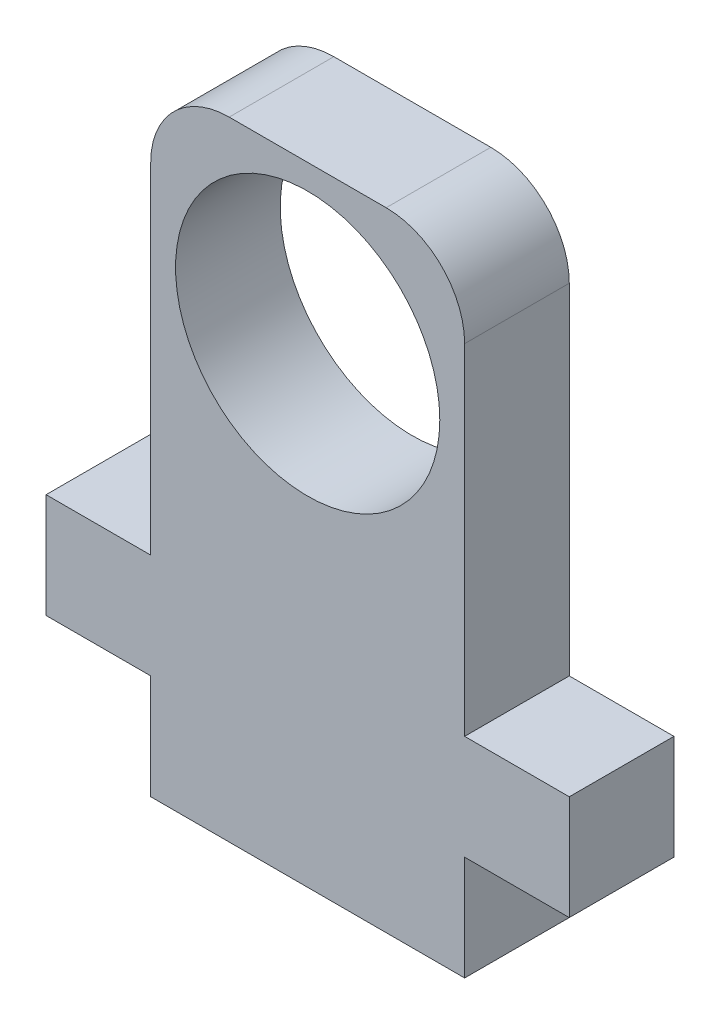
ISO-10303-21;
HEADER;
FILE_DESCRIPTION(('STEP AP214'),'2;1');
FILE_NAME('part.step','',(''),(''),'','','');
FILE_SCHEMA(('AUTOMOTIVE_DESIGN { 1 0 10303 214 1 1 1 1 }'));
ENDSEC;
DATA;
#1=APPLICATION_CONTEXT('core data for automotive mechanical design processes');
#2=APPLICATION_PROTOCOL_DEFINITION('international standard','automotive_design',2000,#1);
#3=PRODUCT_CONTEXT('',#1,'mechanical');
#4=PRODUCT('Part','Part','',(#3));
#5=PRODUCT_RELATED_PRODUCT_CATEGORY('part','',(#4));
#6=PRODUCT_DEFINITION_FORMATION('','',#4);
#7=PRODUCT_DEFINITION_CONTEXT('part definition',#1,'design');
#8=PRODUCT_DEFINITION('design','',#6,#7);
#9=PRODUCT_DEFINITION_SHAPE('','',#8);
#10=(LENGTH_UNIT() NAMED_UNIT(*) SI_UNIT(.MILLI.,.METRE.));
#11=(NAMED_UNIT(*) PLANE_ANGLE_UNIT() SI_UNIT($,.RADIAN.));
#12=(NAMED_UNIT(*) SI_UNIT($,.STERADIAN.) SOLID_ANGLE_UNIT());
#13=UNCERTAINTY_MEASURE_WITH_UNIT(LENGTH_MEASURE(1.E-05),#10,'distance_accuracy_value','');
#14=(GEOMETRIC_REPRESENTATION_CONTEXT(3) GLOBAL_UNCERTAINTY_ASSIGNED_CONTEXT((#13)) GLOBAL_UNIT_ASSIGNED_CONTEXT((#10,
#11,#12)) REPRESENTATION_CONTEXT('',''));
#15=CARTESIAN_POINT('',(0.,0.,0.));
#16=DIRECTION('',(0.,0.,1.));
#17=DIRECTION('',(1.,0.,0.));
#18=AXIS2_PLACEMENT_3D('',#15,#16,#17);
#19=CARTESIAN_POINT('',(7.,17.,4.));
#20=DIRECTION('',(0.,0.,-1.));
#21=DIRECTION('',(-1.,0.,0.));
#22=AXIS2_PLACEMENT_3D('',#19,#20,#21);
#23=PLANE('',#22);
#24=DIRECTION('',(1.,0.,0.));
#25=VECTOR('',#24,1.);
#26=CARTESIAN_POINT('',(4.,0.,4.));
#27=LINE('',#26,#25);
#28=CARTESIAN_POINT('',(0.,0.,4.));
#29=VERTEX_POINT('',#28);
#30=CARTESIAN_POINT('',(4.,0.,4.));
#31=VERTEX_POINT('',#30);
#32=EDGE_CURVE('E197',#29,#31,#27,.T.);
#33=ORIENTED_EDGE('',*,*,#32,.T.);
#34=DIRECTION('',(0.,-1.,0.));
#35=VECTOR('',#34,1.);
#36=CARTESIAN_POINT('',(4.,-4.,4.));
#37=LINE('',#36,#35);
#38=CARTESIAN_POINT('',(4.,-4.,4.));
#39=VERTEX_POINT('',#38);
#40=EDGE_CURVE('E114',#31,#39,#37,.T.);
#41=ORIENTED_EDGE('',*,*,#40,.T.);
#42=DIRECTION('',(1.,0.,0.));
#43=VECTOR('',#42,1.);
#44=CARTESIAN_POINT('',(16.,-4.,4.));
#45=LINE('',#44,#43);
#46=CARTESIAN_POINT('',(16.,-4.,4.));
#47=VERTEX_POINT('',#46);
#48=EDGE_CURVE('E230',#39,#47,#45,.T.);
#49=ORIENTED_EDGE('',*,*,#48,.T.);
#50=DIRECTION('',(0.,1.,0.));
#51=VECTOR('',#50,1.);
#52=CARTESIAN_POINT('',(16.,0.,4.));
#53=LINE('',#52,#51);
#54=CARTESIAN_POINT('',(16.,0.,4.));
#55=VERTEX_POINT('',#54);
#56=EDGE_CURVE('E249',#47,#55,#53,.T.);
#57=ORIENTED_EDGE('',*,*,#56,.T.);
#58=DIRECTION('',(1.,0.,0.));
#59=VECTOR('',#58,1.);
#60=CARTESIAN_POINT('',(20.,0.,4.));
#61=LINE('',#60,#59);
#62=CARTESIAN_POINT('',(20.,0.,4.));
#63=VERTEX_POINT('',#62);
#64=EDGE_CURVE('E246',#55,#63,#61,.T.);
#65=ORIENTED_EDGE('',*,*,#64,.T.);
#66=DIRECTION('',(0.,1.,0.));
#67=VECTOR('',#66,1.);
#68=CARTESIAN_POINT('',(20.,4.,4.));
#69=LINE('',#68,#67);
#70=CARTESIAN_POINT('',(20.,4.,4.));
#71=VERTEX_POINT('',#70);
#72=EDGE_CURVE('E248',#63,#71,#69,.T.);
#73=ORIENTED_EDGE('',*,*,#72,.T.);
#74=DIRECTION('',(-1.,0.,0.));
#75=VECTOR('',#74,1.);
#76=CARTESIAN_POINT('',(16.,4.,4.));
#77=LINE('',#76,#75);
#78=CARTESIAN_POINT('',(16.,4.,4.));
#79=VERTEX_POINT('',#78);
#80=EDGE_CURVE('E251',#71,#79,#77,.T.);
#81=ORIENTED_EDGE('',*,*,#80,.T.);
#82=DIRECTION('',(0.,1.,0.));
#83=VECTOR('',#82,1.);
#84=CARTESIAN_POINT('',(16.,8.,4.));
#85=LINE('',#84,#83);
#86=CARTESIAN_POINT('',(16.,17.,4.));
#87=VERTEX_POINT('',#86);
#88=EDGE_CURVE('E257',#79,#87,#85,.T.);
#89=ORIENTED_EDGE('',*,*,#88,.T.);
#90=CARTESIAN_POINT('',(13.,17.,4.));
#91=DIRECTION('',(0.,0.,1.));
#92=DIRECTION('',(-1.,0.,0.));
#93=AXIS2_PLACEMENT_3D('',#90,#91,#92);
#94=CIRCLE('',#93,3.);
#95=CARTESIAN_POINT('',(13.,20.,4.));
#96=VERTEX_POINT('',#95);
#97=EDGE_CURVE('E259',#87,#96,#94,.T.);
#98=ORIENTED_EDGE('',*,*,#97,.T.);
#99=DIRECTION('',(-1.,0.,0.));
#100=VECTOR('',#99,1.);
#101=CARTESIAN_POINT('',(7.00000000000002,20.,4.));
#102=LINE('',#101,#100);
#103=CARTESIAN_POINT('',(7.00000000000002,20.,4.));
#104=VERTEX_POINT('',#103);
#105=EDGE_CURVE('E261',#96,#104,#102,.T.);
#106=ORIENTED_EDGE('',*,*,#105,.T.);
#107=CARTESIAN_POINT('',(7.,17.,4.));
#108=DIRECTION('',(0.,0.,1.));
#109=DIRECTION('',(-1.,0.,0.));
#110=AXIS2_PLACEMENT_3D('',#107,#108,#109);
#111=CIRCLE('',#110,3.);
#112=CARTESIAN_POINT('',(4.,17.,4.));
#113=VERTEX_POINT('',#112);
#114=EDGE_CURVE('E151',#104,#113,#111,.T.);
#115=ORIENTED_EDGE('',*,*,#114,.T.);
#116=DIRECTION('',(0.,-1.,0.));
#117=VECTOR('',#116,1.);
#118=CARTESIAN_POINT('',(4.,8.,4.));
#119=LINE('',#118,#117);
#120=CARTESIAN_POINT('',(4.,4.,4.));
#121=VERTEX_POINT('',#120);
#122=EDGE_CURVE('E145',#113,#121,#119,.T.);
#123=ORIENTED_EDGE('',*,*,#122,.T.);
#124=DIRECTION('',(-1.,0.,0.));
#125=VECTOR('',#124,1.);
#126=CARTESIAN_POINT('',(0.,4.,4.));
#127=LINE('',#126,#125);
#128=CARTESIAN_POINT('',(0.,4.,4.));
#129=VERTEX_POINT('',#128);
#130=EDGE_CURVE('E149',#121,#129,#127,.T.);
#131=ORIENTED_EDGE('',*,*,#130,.T.);
#132=DIRECTION('',(0.,-1.,0.));
#133=VECTOR('',#132,1.);
#134=CARTESIAN_POINT('',(0.,0.,4.));
#135=LINE('',#134,#133);
#136=EDGE_CURVE('E53',#129,#29,#135,.T.);
#137=ORIENTED_EDGE('',*,*,#136,.T.);
#138=EDGE_LOOP('',(#33,#41,#49,#57,#65,#73,#81,#89,#98,#106,#115,#123,#131,#137));
#139=FACE_BOUND('',#138,.T.);
#140=CARTESIAN_POINT('',(10.,14.,4.));
#141=DIRECTION('',(0.,0.,1.));
#142=DIRECTION('',(1.,0.,0.));
#143=AXIS2_PLACEMENT_3D('',#140,#141,#142);
#144=CIRCLE('',#143,5.05);
#145=CARTESIAN_POINT('',(15.05,14.,4.));
#146=VERTEX_POINT('',#145);
#147=EDGE_CURVE('E172',#146,#146,#144,.T.);
#148=ORIENTED_EDGE('',*,*,#147,.F.);
#149=EDGE_LOOP('',(#148));
#150=FACE_BOUND('',#149,.T.);
#151=ADVANCED_FACE('F36',(#139,#150),#23,.F.);
#152=CARTESIAN_POINT('',(7.,17.,0.));
#153=DIRECTION('',(0.,0.,-1.));
#154=DIRECTION('',(-1.,0.,0.));
#155=AXIS2_PLACEMENT_3D('',#152,#153,#154);
#156=PLANE('',#155);
#157=DIRECTION('',(1.,0.,0.));
#158=VECTOR('',#157,1.);
#159=CARTESIAN_POINT('',(4.,0.,0.));
#160=LINE('',#159,#158);
#161=CARTESIAN_POINT('',(0.,0.,0.));
#162=VERTEX_POINT('',#161);
#163=CARTESIAN_POINT('',(4.,0.,0.));
#164=VERTEX_POINT('',#163);
#165=EDGE_CURVE('E168',#162,#164,#160,.T.);
#166=ORIENTED_EDGE('',*,*,#165,.F.);
#167=DIRECTION('',(0.,-1.,0.));
#168=VECTOR('',#167,1.);
#169=CARTESIAN_POINT('',(0.,0.,0.));
#170=LINE('',#169,#168);
#171=CARTESIAN_POINT('',(0.,4.,0.));
#172=VERTEX_POINT('',#171);
#173=EDGE_CURVE('E106',#172,#162,#170,.T.);
#174=ORIENTED_EDGE('',*,*,#173,.F.);
#175=DIRECTION('',(-1.,0.,0.));
#176=VECTOR('',#175,1.);
#177=CARTESIAN_POINT('',(0.,4.,0.));
#178=LINE('',#177,#176);
#179=CARTESIAN_POINT('',(4.,4.,0.));
#180=VERTEX_POINT('',#179);
#181=EDGE_CURVE('E100',#180,#172,#178,.T.);
#182=ORIENTED_EDGE('',*,*,#181,.F.);
#183=DIRECTION('',(0.,-1.,0.));
#184=VECTOR('',#183,1.);
#185=CARTESIAN_POINT('',(4.,4.,0.));
#186=LINE('',#185,#184);
#187=CARTESIAN_POINT('',(4.,17.,0.));
#188=VERTEX_POINT('',#187);
#189=EDGE_CURVE('E158',#188,#180,#186,.T.);
#190=ORIENTED_EDGE('',*,*,#189,.F.);
#191=CARTESIAN_POINT('',(7.,17.,0.));
#192=DIRECTION('',(0.,0.,1.));
#193=DIRECTION('',(-1.,0.,0.));
#194=AXIS2_PLACEMENT_3D('',#191,#192,#193);
#195=CIRCLE('',#194,3.);
#196=CARTESIAN_POINT('',(7.00000000000002,20.,0.));
#197=VERTEX_POINT('',#196);
#198=EDGE_CURVE('E191',#197,#188,#195,.T.);
#199=ORIENTED_EDGE('',*,*,#198,.F.);
#200=DIRECTION('',(-1.,0.,0.));
#201=VECTOR('',#200,1.);
#202=CARTESIAN_POINT('',(7.00000000000002,20.,0.));
#203=LINE('',#202,#201);
#204=CARTESIAN_POINT('',(13.,20.,0.));
#205=VERTEX_POINT('',#204);
#206=EDGE_CURVE('E189',#205,#197,#203,.T.);
#207=ORIENTED_EDGE('',*,*,#206,.F.);
#208=CARTESIAN_POINT('',(13.,17.,0.));
#209=DIRECTION('',(0.,0.,1.));
#210=DIRECTION('',(-1.,0.,0.));
#211=AXIS2_PLACEMENT_3D('',#208,#209,#210);
#212=CIRCLE('',#211,3.);
#213=CARTESIAN_POINT('',(16.,17.,0.));
#214=VERTEX_POINT('',#213);
#215=EDGE_CURVE('E187',#214,#205,#212,.T.);
#216=ORIENTED_EDGE('',*,*,#215,.F.);
#217=DIRECTION('',(0.,1.,0.));
#218=VECTOR('',#217,1.);
#219=CARTESIAN_POINT('',(16.,17.,0.));
#220=LINE('',#219,#218);
#221=CARTESIAN_POINT('',(16.,4.,0.));
#222=VERTEX_POINT('',#221);
#223=EDGE_CURVE('E185',#222,#214,#220,.T.);
#224=ORIENTED_EDGE('',*,*,#223,.F.);
#225=DIRECTION('',(-1.,0.,0.));
#226=VECTOR('',#225,1.);
#227=CARTESIAN_POINT('',(16.,4.,0.));
#228=LINE('',#227,#226);
#229=CARTESIAN_POINT('',(20.,4.,0.));
#230=VERTEX_POINT('',#229);
#231=EDGE_CURVE('E182',#230,#222,#228,.T.);
#232=ORIENTED_EDGE('',*,*,#231,.F.);
#233=DIRECTION('',(0.,1.,0.));
#234=VECTOR('',#233,1.);
#235=CARTESIAN_POINT('',(20.,4.,0.));
#236=LINE('',#235,#234);
#237=CARTESIAN_POINT('',(20.,0.,0.));
#238=VERTEX_POINT('',#237);
#239=EDGE_CURVE('E180',#238,#230,#236,.T.);
#240=ORIENTED_EDGE('',*,*,#239,.F.);
#241=DIRECTION('',(1.,0.,0.));
#242=VECTOR('',#241,1.);
#243=CARTESIAN_POINT('',(20.,0.,0.));
#244=LINE('',#243,#242);
#245=CARTESIAN_POINT('',(16.,0.,0.));
#246=VERTEX_POINT('',#245);
#247=EDGE_CURVE('E178',#246,#238,#244,.T.);
#248=ORIENTED_EDGE('',*,*,#247,.F.);
#249=DIRECTION('',(0.,1.,0.));
#250=VECTOR('',#249,1.);
#251=CARTESIAN_POINT('',(16.,0.,0.));
#252=LINE('',#251,#250);
#253=CARTESIAN_POINT('',(16.,-4.,0.));
#254=VERTEX_POINT('',#253);
#255=EDGE_CURVE('E176',#254,#246,#252,.T.);
#256=ORIENTED_EDGE('',*,*,#255,.F.);
#257=DIRECTION('',(1.,0.,0.));
#258=VECTOR('',#257,1.);
#259=CARTESIAN_POINT('',(16.,-4.,0.));
#260=LINE('',#259,#258);
#261=CARTESIAN_POINT('',(4.,-4.,0.));
#262=VERTEX_POINT('',#261);
#263=EDGE_CURVE('E174',#262,#254,#260,.T.);
#264=ORIENTED_EDGE('',*,*,#263,.F.);
#265=DIRECTION('',(0.,-1.,0.));
#266=VECTOR('',#265,1.);
#267=CARTESIAN_POINT('',(4.,-4.,0.));
#268=LINE('',#267,#266);
#269=EDGE_CURVE('E171',#164,#262,#268,.T.);
#270=ORIENTED_EDGE('',*,*,#269,.F.);
#271=EDGE_LOOP('',(#166,#174,#182,#190,#199,#207,#216,#224,#232,#240,#248,#256,#264,#270));
#272=FACE_BOUND('',#271,.T.);
#273=CARTESIAN_POINT('',(10.,14.,0.));
#274=DIRECTION('',(0.,0.,1.));
#275=DIRECTION('',(1.,0.,0.));
#276=AXIS2_PLACEMENT_3D('',#273,#274,#275);
#277=CIRCLE('',#276,5.05);
#278=CARTESIAN_POINT('',(15.05,14.,0.));
#279=VERTEX_POINT('',#278);
#280=EDGE_CURVE('E439',#279,#279,#277,.T.);
#281=ORIENTED_EDGE('',*,*,#280,.T.);
#282=EDGE_LOOP('',(#281));
#283=FACE_BOUND('',#282,.T.);
#284=ADVANCED_FACE('F234',(#272,#283),#156,.T.);
#285=CARTESIAN_POINT('',(4.,0.,4.));
#286=DIRECTION('',(0.,1.,0.));
#287=DIRECTION('',(-1.,0.,0.));
#288=AXIS2_PLACEMENT_3D('',#285,#286,#287);
#289=PLANE('',#288);
#290=ORIENTED_EDGE('',*,*,#165,.T.);
#291=DIRECTION('',(0.,0.,-1.));
#292=VECTOR('',#291,1.);
#293=CARTESIAN_POINT('',(4.,0.,4.));
#294=LINE('',#293,#292);
#295=EDGE_CURVE('E11',#31,#164,#294,.T.);
#296=ORIENTED_EDGE('',*,*,#295,.F.);
#297=ORIENTED_EDGE('',*,*,#32,.F.);
#298=DIRECTION('',(0.,0.,-1.));
#299=VECTOR('',#298,1.);
#300=CARTESIAN_POINT('',(0.,0.,4.));
#301=LINE('',#300,#299);
#302=EDGE_CURVE('E164',#29,#162,#301,.T.);
#303=ORIENTED_EDGE('',*,*,#302,.T.);
#304=EDGE_LOOP('',(#290,#296,#297,#303));
#305=FACE_BOUND('',#304,.T.);
#306=ADVANCED_FACE('F38',(#305),#289,.F.);
#307=CARTESIAN_POINT('',(4.,-4.,4.));
#308=DIRECTION('',(1.,0.,0.));
#309=DIRECTION('',(0.,0.,-1.));
#310=AXIS2_PLACEMENT_3D('',#307,#308,#309);
#311=PLANE('',#310);
#312=ORIENTED_EDGE('',*,*,#269,.T.);
#313=DIRECTION('',(0.,0.,-1.));
#314=VECTOR('',#313,1.);
#315=CARTESIAN_POINT('',(4.,-4.,4.));
#316=LINE('',#315,#314);
#317=EDGE_CURVE('E45',#39,#262,#316,.T.);
#318=ORIENTED_EDGE('',*,*,#317,.F.);
#319=ORIENTED_EDGE('',*,*,#40,.F.);
#320=ORIENTED_EDGE('',*,*,#295,.T.);
#321=EDGE_LOOP('',(#312,#318,#319,#320));
#322=FACE_BOUND('',#321,.T.);
#323=ADVANCED_FACE('F296',(#322),#311,.F.);
#324=CARTESIAN_POINT('',(16.,-4.,4.));
#325=DIRECTION('',(0.,1.,0.));
#326=DIRECTION('',(-1.,0.,0.));
#327=AXIS2_PLACEMENT_3D('',#324,#325,#326);
#328=PLANE('',#327);
#329=ORIENTED_EDGE('',*,*,#263,.T.);
#330=DIRECTION('',(0.,0.,-1.));
#331=VECTOR('',#330,1.);
#332=CARTESIAN_POINT('',(16.,-4.,4.));
#333=LINE('',#332,#331);
#334=EDGE_CURVE('E222',#47,#254,#333,.T.);
#335=ORIENTED_EDGE('',*,*,#334,.F.);
#336=ORIENTED_EDGE('',*,*,#48,.F.);
#337=ORIENTED_EDGE('',*,*,#317,.T.);
#338=EDGE_LOOP('',(#329,#335,#336,#337));
#339=FACE_BOUND('',#338,.T.);
#340=ADVANCED_FACE('F228',(#339),#328,.F.);
#341=CARTESIAN_POINT('',(16.,0.,4.));
#342=DIRECTION('',(-1.,0.,0.));
#343=DIRECTION('',(0.,0.,1.));
#344=AXIS2_PLACEMENT_3D('',#341,#342,#343);
#345=PLANE('',#344);
#346=ORIENTED_EDGE('',*,*,#255,.T.);
#347=DIRECTION('',(0.,0.,-1.));
#348=VECTOR('',#347,1.);
#349=CARTESIAN_POINT('',(16.,0.,4.));
#350=LINE('',#349,#348);
#351=EDGE_CURVE('E219',#55,#246,#350,.T.);
#352=ORIENTED_EDGE('',*,*,#351,.F.);
#353=ORIENTED_EDGE('',*,*,#56,.F.);
#354=ORIENTED_EDGE('',*,*,#334,.T.);
#355=EDGE_LOOP('',(#346,#352,#353,#354));
#356=FACE_BOUND('',#355,.T.);
#357=ADVANCED_FACE('F240',(#356),#345,.F.);
#358=CARTESIAN_POINT('',(20.,0.,4.));
#359=DIRECTION('',(0.,1.,0.));
#360=DIRECTION('',(-1.,0.,0.));
#361=AXIS2_PLACEMENT_3D('',#358,#359,#360);
#362=PLANE('',#361);
#363=ORIENTED_EDGE('',*,*,#247,.T.);
#364=DIRECTION('',(0.,0.,-1.));
#365=VECTOR('',#364,1.);
#366=CARTESIAN_POINT('',(20.,0.,4.));
#367=LINE('',#366,#365);
#368=EDGE_CURVE('E216',#63,#238,#367,.T.);
#369=ORIENTED_EDGE('',*,*,#368,.F.);
#370=ORIENTED_EDGE('',*,*,#64,.F.);
#371=ORIENTED_EDGE('',*,*,#351,.T.);
#372=EDGE_LOOP('',(#363,#369,#370,#371));
#373=FACE_BOUND('',#372,.T.);
#374=ADVANCED_FACE('F244',(#373),#362,.F.);
#375=CARTESIAN_POINT('',(20.,4.,4.));
#376=DIRECTION('',(-1.,0.,0.));
#377=DIRECTION('',(0.,0.,1.));
#378=AXIS2_PLACEMENT_3D('',#375,#376,#377);
#379=PLANE('',#378);
#380=ORIENTED_EDGE('',*,*,#239,.T.);
#381=DIRECTION('',(0.,0.,-1.));
#382=VECTOR('',#381,1.);
#383=CARTESIAN_POINT('',(20.,4.,4.));
#384=LINE('',#383,#382);
#385=EDGE_CURVE('E213',#71,#230,#384,.T.);
#386=ORIENTED_EDGE('',*,*,#385,.F.);
#387=ORIENTED_EDGE('',*,*,#72,.F.);
#388=ORIENTED_EDGE('',*,*,#368,.T.);
#389=EDGE_LOOP('',(#380,#386,#387,#388));
#390=FACE_BOUND('',#389,.T.);
#391=ADVANCED_FACE('F309',(#390),#379,.F.);
#392=CARTESIAN_POINT('',(16.,4.,4.));
#393=DIRECTION('',(0.,-1.,0.));
#394=DIRECTION('',(0.,0.,-1.));
#395=AXIS2_PLACEMENT_3D('',#392,#393,#394);
#396=PLANE('',#395);
#397=ORIENTED_EDGE('',*,*,#231,.T.);
#398=DIRECTION('',(0.,0.,-1.));
#399=VECTOR('',#398,1.);
#400=CARTESIAN_POINT('',(16.,4.,4.));
#401=LINE('',#400,#399);
#402=EDGE_CURVE('E210',#79,#222,#401,.T.);
#403=ORIENTED_EDGE('',*,*,#402,.F.);
#404=ORIENTED_EDGE('',*,*,#80,.F.);
#405=ORIENTED_EDGE('',*,*,#385,.T.);
#406=EDGE_LOOP('',(#397,#403,#404,#405));
#407=FACE_BOUND('',#406,.T.);
#408=ADVANCED_FACE('F312',(#407),#396,.F.);
#409=CARTESIAN_POINT('',(16.,17.,4.));
#410=DIRECTION('',(-1.,0.,0.));
#411=DIRECTION('',(0.,0.,1.));
#412=AXIS2_PLACEMENT_3D('',#409,#410,#411);
#413=PLANE('',#412);
#414=ORIENTED_EDGE('',*,*,#223,.T.);
#415=DIRECTION('',(0.,0.,-1.));
#416=VECTOR('',#415,1.);
#417=CARTESIAN_POINT('',(16.,17.,4.));
#418=LINE('',#417,#416);
#419=EDGE_CURVE('E207',#87,#214,#418,.T.);
#420=ORIENTED_EDGE('',*,*,#419,.F.);
#421=ORIENTED_EDGE('',*,*,#88,.F.);
#422=ORIENTED_EDGE('',*,*,#402,.T.);
#423=EDGE_LOOP('',(#414,#420,#421,#422));
#424=FACE_BOUND('',#423,.T.);
#425=ADVANCED_FACE('F316',(#424),#413,.F.);
#426=CARTESIAN_POINT('',(13.,17.,4.));
#427=DIRECTION('',(0.,0.,-1.));
#428=DIRECTION('',(-1.,0.,0.));
#429=AXIS2_PLACEMENT_3D('',#426,#427,#428);
#430=CYLINDRICAL_SURFACE('',#429,3.);
#431=ORIENTED_EDGE('',*,*,#215,.T.);
#432=DIRECTION('',(0.,0.,-1.));
#433=VECTOR('',#432,1.);
#434=CARTESIAN_POINT('',(13.,20.,4.));
#435=LINE('',#434,#433);
#436=EDGE_CURVE('E204',#96,#205,#435,.T.);
#437=ORIENTED_EDGE('',*,*,#436,.F.);
#438=ORIENTED_EDGE('',*,*,#97,.F.);
#439=ORIENTED_EDGE('',*,*,#419,.T.);
#440=EDGE_LOOP('',(#431,#437,#438,#439));
#441=FACE_BOUND('',#440,.T.);
#442=ADVANCED_FACE('F320',(#441),#430,.T.);
#443=CARTESIAN_POINT('',(7.00000000000002,20.,4.));
#444=DIRECTION('',(0.,-1.,0.));
#445=DIRECTION('',(0.,0.,-1.));
#446=AXIS2_PLACEMENT_3D('',#443,#444,#445);
#447=PLANE('',#446);
#448=ORIENTED_EDGE('',*,*,#206,.T.);
#449=DIRECTION('',(0.,0.,-1.));
#450=VECTOR('',#449,1.);
#451=CARTESIAN_POINT('',(7.00000000000002,20.,4.));
#452=LINE('',#451,#450);
#453=EDGE_CURVE('E201',#104,#197,#452,.T.);
#454=ORIENTED_EDGE('',*,*,#453,.F.);
#455=ORIENTED_EDGE('',*,*,#105,.F.);
#456=ORIENTED_EDGE('',*,*,#436,.T.);
#457=EDGE_LOOP('',(#448,#454,#455,#456));
#458=FACE_BOUND('',#457,.T.);
#459=ADVANCED_FACE('F267',(#458),#447,.F.);
#460=CARTESIAN_POINT('',(7.,17.,4.));
#461=DIRECTION('',(0.,0.,-1.));
#462=DIRECTION('',(-1.,0.,0.));
#463=AXIS2_PLACEMENT_3D('',#460,#461,#462);
#464=CYLINDRICAL_SURFACE('',#463,3.);
#465=ORIENTED_EDGE('',*,*,#198,.T.);
#466=DIRECTION('',(0.,0.,-1.));
#467=VECTOR('',#466,1.);
#468=CARTESIAN_POINT('',(4.,17.,4.));
#469=LINE('',#468,#467);
#470=EDGE_CURVE('E159',#113,#188,#469,.T.);
#471=ORIENTED_EDGE('',*,*,#470,.F.);
#472=ORIENTED_EDGE('',*,*,#114,.F.);
#473=ORIENTED_EDGE('',*,*,#453,.T.);
#474=EDGE_LOOP('',(#465,#471,#472,#473));
#475=FACE_BOUND('',#474,.T.);
#476=ADVANCED_FACE('F271',(#475),#464,.T.);
#477=CARTESIAN_POINT('',(4.,4.,4.));
#478=DIRECTION('',(1.,0.,0.));
#479=DIRECTION('',(0.,0.,-1.));
#480=AXIS2_PLACEMENT_3D('',#477,#478,#479);
#481=PLANE('',#480);
#482=ORIENTED_EDGE('',*,*,#189,.T.);
#483=DIRECTION('',(0.,0.,-1.));
#484=VECTOR('',#483,1.);
#485=CARTESIAN_POINT('',(4.,4.,4.));
#486=LINE('',#485,#484);
#487=EDGE_CURVE('E156',#121,#180,#486,.T.);
#488=ORIENTED_EDGE('',*,*,#487,.F.);
#489=ORIENTED_EDGE('',*,*,#122,.F.);
#490=ORIENTED_EDGE('',*,*,#470,.T.);
#491=EDGE_LOOP('',(#482,#488,#489,#490));
#492=FACE_BOUND('',#491,.T.);
#493=ADVANCED_FACE('F157',(#492),#481,.F.);
#494=CARTESIAN_POINT('',(0.,4.,4.));
#495=DIRECTION('',(0.,-1.,0.));
#496=DIRECTION('',(0.,0.,-1.));
#497=AXIS2_PLACEMENT_3D('',#494,#495,#496);
#498=PLANE('',#497);
#499=ORIENTED_EDGE('',*,*,#181,.T.);
#500=DIRECTION('',(0.,0.,-1.));
#501=VECTOR('',#500,1.);
#502=CARTESIAN_POINT('',(0.,4.,4.));
#503=LINE('',#502,#501);
#504=EDGE_CURVE('E160',#129,#172,#503,.T.);
#505=ORIENTED_EDGE('',*,*,#504,.F.);
#506=ORIENTED_EDGE('',*,*,#130,.F.);
#507=ORIENTED_EDGE('',*,*,#487,.T.);
#508=EDGE_LOOP('',(#499,#505,#506,#507));
#509=FACE_BOUND('',#508,.T.);
#510=ADVANCED_FACE('F162',(#509),#498,.F.);
#511=CARTESIAN_POINT('',(0.,0.,4.));
#512=DIRECTION('',(1.,0.,0.));
#513=DIRECTION('',(0.,0.,-1.));
#514=AXIS2_PLACEMENT_3D('',#511,#512,#513);
#515=PLANE('',#514);
#516=ORIENTED_EDGE('',*,*,#173,.T.);
#517=ORIENTED_EDGE('',*,*,#302,.F.);
#518=ORIENTED_EDGE('',*,*,#136,.F.);
#519=ORIENTED_EDGE('',*,*,#504,.T.);
#520=EDGE_LOOP('',(#516,#517,#518,#519));
#521=FACE_BOUND('',#520,.T.);
#522=ADVANCED_FACE('F276',(#521),#515,.F.);
#523=CARTESIAN_POINT('',(10.,14.,4.));
#524=DIRECTION('',(0.,0.,-1.));
#525=DIRECTION('',(-1.,0.,0.));
#526=AXIS2_PLACEMENT_3D('',#523,#524,#525);
#527=CYLINDRICAL_SURFACE('',#526,5.05);
#528=ORIENTED_EDGE('',*,*,#147,.T.);
#529=EDGE_LOOP('',(#528));
#530=FACE_BOUND('',#529,.T.);
#531=ORIENTED_EDGE('',*,*,#280,.F.);
#532=EDGE_LOOP('',(#531));
#533=FACE_BOUND('',#532,.T.);
#534=ADVANCED_FACE('F278',(#530,#533),#527,.F.);
#535=CLOSED_SHELL('',(#151,#284,#306,#323,#340,#357,#374,#391,#408,#425,#442,#459,#476,#493,
#510,#522,#534));
#536=MANIFOLD_SOLID_BREP('B2',#535);
#537=ADVANCED_BREP_SHAPE_REPRESENTATION('',(#18,#536),#14);
#538=SHAPE_DEFINITION_REPRESENTATION(#9,#537);
ENDSEC;
END-ISO-10303-21;
